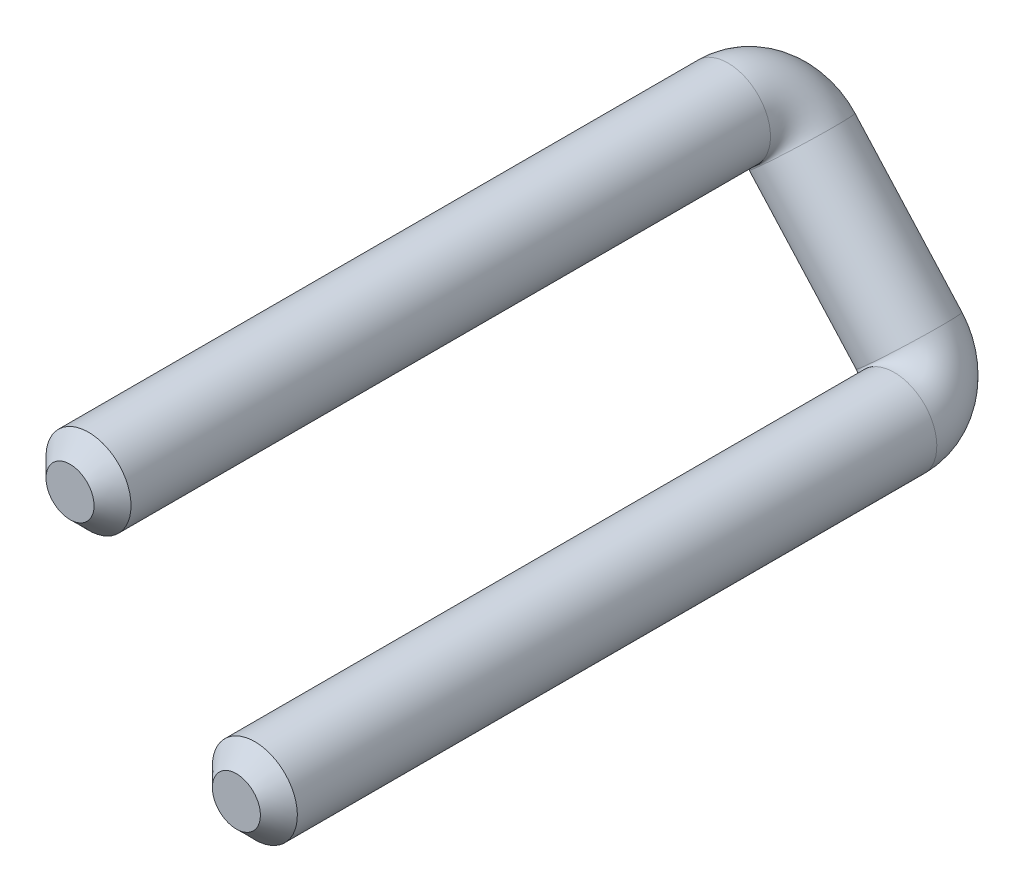
ISO-10303-21;
HEADER;
FILE_DESCRIPTION(('STEP AP214'),'2;1');
FILE_NAME('part.step','',(''),(''),'','','');
FILE_SCHEMA(('AUTOMOTIVE_DESIGN { 1 0 10303 214 1 1 1 1 }'));
ENDSEC;
DATA;
#1=APPLICATION_CONTEXT('core data for automotive mechanical design processes');
#2=APPLICATION_PROTOCOL_DEFINITION('international standard','automotive_design',2000,#1);
#3=PRODUCT_CONTEXT('',#1,'mechanical');
#4=PRODUCT('Part','Part','',(#3));
#5=PRODUCT_RELATED_PRODUCT_CATEGORY('part','',(#4));
#6=PRODUCT_DEFINITION_FORMATION('','',#4);
#7=PRODUCT_DEFINITION_CONTEXT('part definition',#1,'design');
#8=PRODUCT_DEFINITION('design','',#6,#7);
#9=PRODUCT_DEFINITION_SHAPE('','',#8);
#10=(LENGTH_UNIT() NAMED_UNIT(*) SI_UNIT(.MILLI.,.METRE.));
#11=(NAMED_UNIT(*) PLANE_ANGLE_UNIT() SI_UNIT($,.RADIAN.));
#12=(NAMED_UNIT(*) SI_UNIT($,.STERADIAN.) SOLID_ANGLE_UNIT());
#13=UNCERTAINTY_MEASURE_WITH_UNIT(LENGTH_MEASURE(1.E-05),#10,'distance_accuracy_value','');
#14=(GEOMETRIC_REPRESENTATION_CONTEXT(3) GLOBAL_UNCERTAINTY_ASSIGNED_CONTEXT((#13)) GLOBAL_UNIT_ASSIGNED_CONTEXT((#10,
#11,#12)) REPRESENTATION_CONTEXT('',''));
#15=CARTESIAN_POINT('',(0.,0.,0.));
#16=DIRECTION('',(0.,0.,1.));
#17=DIRECTION('',(1.,0.,0.));
#18=AXIS2_PLACEMENT_3D('',#15,#16,#17);
#19=CARTESIAN_POINT('',(-8.38116,-21.107622,-8.3));
#20=DIRECTION('',(0.,0.,1.));
#21=DIRECTION('',(1.,0.,0.));
#22=AXIS2_PLACEMENT_3D('',#19,#20,#21);
#23=CYLINDRICAL_SURFACE('',#22,1.15);
#24=CARTESIAN_POINT('',(-8.38116,-21.107622,9.));
#25=DIRECTION('',(0.,0.,-1.));
#26=DIRECTION('',(-1.,0.,0.));
#27=AXIS2_PLACEMENT_3D('',#24,#25,#26);
#28=CIRCLE('',#27,1.15);
#29=CARTESIAN_POINT('',(-9.53116,-21.107622,9.));
#30=VERTEX_POINT('',#29);
#31=EDGE_CURVE('E29',#30,#30,#28,.T.);
#32=ORIENTED_EDGE('',*,*,#31,.T.);
#33=EDGE_LOOP('',(#32));
#34=FACE_BOUND('',#33,.T.);
#35=CARTESIAN_POINT('',(-8.38116,-21.107622,-8.3));
#36=DIRECTION('',(0.,0.,-1.));
#37=DIRECTION('',(0.104972375690607,0.994475138121547,0.));
#38=AXIS2_PLACEMENT_3D('',#35,#36,#37);
#39=CIRCLE('',#38,1.15);
#40=CARTESIAN_POINT('',(-7.61185055863418,-21.9624102681842,-8.3));
#41=VERTEX_POINT('',#40);
#42=EDGE_CURVE('E34',#41,#41,#39,.T.);
#43=ORIENTED_EDGE('',*,*,#42,.F.);
#44=EDGE_LOOP('',(#43));
#45=FACE_BOUND('',#44,.T.);
#46=ADVANCED_FACE('F15',(#34,#45),#23,.T.);
#47=CARTESIAN_POINT('',(-9.18391767794695,-20.2156690245034,-8.3));
#48=DIRECTION('',(-0.743294146247166,-0.66896473162245,0.));
#49=DIRECTION('',(0.66896473162245,-0.743294146247166,0.));
#50=AXIS2_PLACEMENT_3D('',#47,#48,#49);
#51=TOROIDAL_SURFACE('',#50,1.2,1.15);
#52=CARTESIAN_POINT('',(-9.18391767794694,-20.2156690245034,-9.5));
#53=DIRECTION('',(-0.668964731622449,0.743294146247167,0.));
#54=DIRECTION('',(0.552486187845303,0.497237569060773,0.668964731622451));
#55=AXIS2_PLACEMENT_3D('',#52,#53,#54);
#56=CIRCLE('',#55,1.15);
#57=CARTESIAN_POINT('',(-9.18391767794693,-20.2156690245034,-10.65));
#58=VERTEX_POINT('',#57);
#59=EDGE_CURVE('E37',#58,#58,#56,.T.);
#60=CARTESIAN_POINT('',(-9.18391767794695,-20.2156690245034,-8.3));
#61=DIRECTION('',(-0.743294146247166,-0.66896473162245,0.));
#62=DIRECTION('',(0.66896473162245,-0.743294146247166,0.));
#63=AXIS2_PLACEMENT_3D('',#60,#61,#62);
#64=CIRCLE('',#63,2.35);
#65=EDGE_CURVE('',#58,#41,#64,.T.);
#66=ORIENTED_EDGE('',*,*,#59,.F.);
#67=ORIENTED_EDGE('',*,*,#42,.T.);
#68=ORIENTED_EDGE('',*,*,#65,.T.);
#69=ORIENTED_EDGE('',*,*,#65,.F.);
#70=EDGE_LOOP('',(#66,#68,#67,#69));
#71=FACE_BOUND('',#70,.T.);
#72=ADVANCED_FACE('F58',(#71),#51,.T.);
#73=CARTESIAN_POINT('',(-12.0784023220531,-16.9995749754966,-9.5));
#74=DIRECTION('',(0.66896473162245,-0.743294146247166,0.));
#75=DIRECTION('',(0.743294146247166,0.66896473162245,0.));
#76=AXIS2_PLACEMENT_3D('',#73,#74,#75);
#77=CYLINDRICAL_SURFACE('',#76,1.15);
#78=CARTESIAN_POINT('',(-12.0784023220531,-16.9995749754966,-9.5));
#79=DIRECTION('',(-0.668964731622449,0.743294146247167,0.));
#80=DIRECTION('',(0.552486187845303,0.497237569060773,0.668964731622451));
#81=AXIS2_PLACEMENT_3D('',#78,#79,#80);
#82=CIRCLE('',#81,1.15);
#83=CARTESIAN_POINT('',(-12.0784023220531,-16.9995749754966,-10.65));
#84=VERTEX_POINT('',#83);
#85=EDGE_CURVE('E40',#84,#84,#82,.T.);
#86=ORIENTED_EDGE('',*,*,#85,.F.);
#87=EDGE_LOOP('',(#86));
#88=FACE_BOUND('',#87,.T.);
#89=ORIENTED_EDGE('',*,*,#59,.T.);
#90=EDGE_LOOP('',(#89));
#91=FACE_BOUND('',#90,.T.);
#92=ADVANCED_FACE('F52',(#88,#91),#77,.T.);
#93=CARTESIAN_POINT('',(-12.0784023220531,-16.9995749754966,-8.3));
#94=DIRECTION('',(-0.743294146247166,-0.66896473162245,0.));
#95=DIRECTION('',(0.66896473162245,-0.743294146247166,0.));
#96=AXIS2_PLACEMENT_3D('',#93,#94,#95);
#97=TOROIDAL_SURFACE('',#96,1.2,1.15);
#98=CARTESIAN_POINT('',(-12.88116,-16.107622,-8.3));
#99=DIRECTION('',(0.,0.,1.));
#100=DIRECTION('',(1.,0.,0.));
#101=AXIS2_PLACEMENT_3D('',#98,#99,#100);
#102=CIRCLE('',#101,1.15);
#103=CARTESIAN_POINT('',(-13.6504694413658,-15.2528337318158,-8.3));
#104=VERTEX_POINT('',#103);
#105=EDGE_CURVE('E43',#104,#104,#102,.T.);
#106=CARTESIAN_POINT('',(-12.0784023220531,-16.9995749754966,-8.3));
#107=DIRECTION('',(-0.743294146247166,-0.66896473162245,0.));
#108=DIRECTION('',(0.66896473162245,-0.743294146247166,0.));
#109=AXIS2_PLACEMENT_3D('',#106,#107,#108);
#110=CIRCLE('',#109,2.35);
#111=EDGE_CURVE('',#104,#84,#110,.T.);
#112=ORIENTED_EDGE('',*,*,#105,.F.);
#113=ORIENTED_EDGE('',*,*,#85,.T.);
#114=ORIENTED_EDGE('',*,*,#111,.T.);
#115=ORIENTED_EDGE('',*,*,#111,.F.);
#116=EDGE_LOOP('',(#112,#114,#113,#115));
#117=FACE_BOUND('',#116,.T.);
#118=ADVANCED_FACE('F49',(#117),#97,.T.);
#119=CARTESIAN_POINT('',(-12.88116,-16.107622,-8.3));
#120=DIRECTION('',(0.,0.,1.));
#121=DIRECTION('',(1.,0.,0.));
#122=AXIS2_PLACEMENT_3D('',#119,#120,#121);
#123=CYLINDRICAL_SURFACE('',#122,1.15);
#124=CARTESIAN_POINT('',(-12.88116,-16.107622,9.));
#125=DIRECTION('',(0.,0.,1.));
#126=DIRECTION('',(1.,0.,0.));
#127=AXIS2_PLACEMENT_3D('',#124,#125,#126);
#128=CIRCLE('',#127,1.15);
#129=CARTESIAN_POINT('',(-11.73116,-16.107622,9.));
#130=VERTEX_POINT('',#129);
#131=EDGE_CURVE('E10',#130,#130,#128,.F.);
#132=ORIENTED_EDGE('',*,*,#131,.T.);
#133=EDGE_LOOP('',(#132));
#134=FACE_BOUND('',#133,.T.);
#135=ORIENTED_EDGE('',*,*,#105,.T.);
#136=EDGE_LOOP('',(#135));
#137=FACE_BOUND('',#136,.T.);
#138=ADVANCED_FACE('F47',(#134,#137),#123,.T.);
#139=CARTESIAN_POINT('',(-8.38116,-21.107622,9.5));
#140=DIRECTION('',(0.,0.,-1.));
#141=DIRECTION('',(0.104972375690607,0.994475138121547,0.));
#142=AXIS2_PLACEMENT_3D('',#139,#140,#141);
#143=PLANE('',#142);
#144=CARTESIAN_POINT('',(-8.38116,-21.107622,9.5));
#145=DIRECTION('',(0.,0.,-1.));
#146=DIRECTION('',(-1.,0.,0.));
#147=AXIS2_PLACEMENT_3D('',#144,#145,#146);
#148=CIRCLE('',#147,0.65);
#149=CARTESIAN_POINT('',(-9.03116,-21.107622,9.5));
#150=VERTEX_POINT('',#149);
#151=EDGE_CURVE('E25',#150,#150,#148,.F.);
#152=ORIENTED_EDGE('',*,*,#151,.T.);
#153=EDGE_LOOP('',(#152));
#154=FACE_BOUND('',#153,.T.);
#155=ADVANCED_FACE('F87',(#154),#143,.F.);
#156=CARTESIAN_POINT('',(-12.88116,-16.107622,9.5));
#157=DIRECTION('',(0.,0.,1.));
#158=DIRECTION('',(1.,0.,0.));
#159=AXIS2_PLACEMENT_3D('',#156,#157,#158);
#160=PLANE('',#159);
#161=CARTESIAN_POINT('',(-12.88116,-16.107622,9.5));
#162=DIRECTION('',(0.,0.,1.));
#163=DIRECTION('',(1.,0.,0.));
#164=AXIS2_PLACEMENT_3D('',#161,#162,#163);
#165=CIRCLE('',#164,0.65);
#166=CARTESIAN_POINT('',(-12.23116,-16.107622,9.5));
#167=VERTEX_POINT('',#166);
#168=EDGE_CURVE('E21',#167,#167,#165,.T.);
#169=ORIENTED_EDGE('',*,*,#168,.T.);
#170=EDGE_LOOP('',(#169));
#171=FACE_BOUND('',#170,.T.);
#172=ADVANCED_FACE('F77',(#171),#160,.T.);
#173=CARTESIAN_POINT('',(-8.38116,-21.107622,9.));
#174=DIRECTION('',(0.,0.,-1.));
#175=DIRECTION('',(-1.,0.,0.));
#176=AXIS2_PLACEMENT_3D('',#173,#174,#175);
#177=CONICAL_SURFACE('',#176,1.15,0.785398163397449);
#178=ORIENTED_EDGE('',*,*,#151,.F.);
#179=EDGE_LOOP('',(#178));
#180=FACE_BOUND('',#179,.T.);
#181=ORIENTED_EDGE('',*,*,#31,.F.);
#182=EDGE_LOOP('',(#181));
#183=FACE_BOUND('',#182,.T.);
#184=ADVANCED_FACE('F74',(#180,#183),#177,.T.);
#185=CARTESIAN_POINT('',(-12.88116,-16.107622,9.5));
#186=DIRECTION('',(0.,0.,-1.));
#187=DIRECTION('',(-1.,0.,0.));
#188=AXIS2_PLACEMENT_3D('',#185,#186,#187);
#189=CONICAL_SURFACE('',#188,0.65,0.785398163397443);
#190=ORIENTED_EDGE('',*,*,#131,.F.);
#191=EDGE_LOOP('',(#190));
#192=FACE_BOUND('',#191,.T.);
#193=ORIENTED_EDGE('',*,*,#168,.F.);
#194=EDGE_LOOP('',(#193));
#195=FACE_BOUND('',#194,.T.);
#196=ADVANCED_FACE('F76',(#192,#195),#189,.T.);
#197=CLOSED_SHELL('',(#46,#72,#92,#118,#138,#155,#172,#184,#196));
#198=MANIFOLD_SOLID_BREP('B1',#197);
#199=ADVANCED_BREP_SHAPE_REPRESENTATION('',(#18,#198),#14);
#200=SHAPE_DEFINITION_REPRESENTATION(#9,#199);
ENDSEC;
END-ISO-10303-21;
